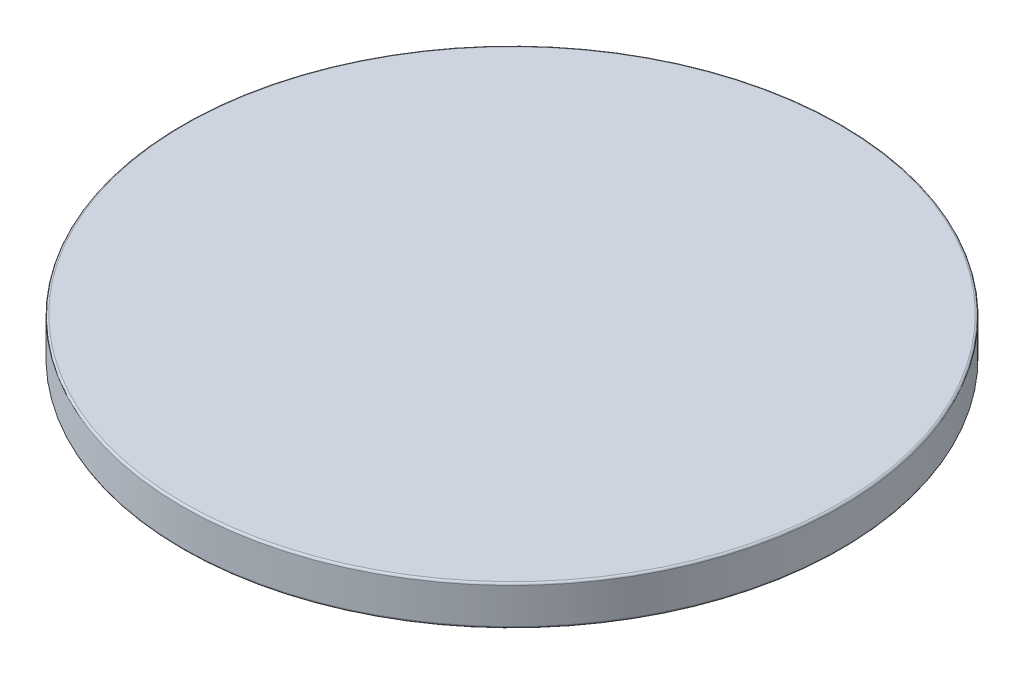
ISO-10303-21;
HEADER;
FILE_DESCRIPTION(('STEP AP214'),'2;1');
FILE_NAME('part.step','',(''),(''),'','','');
FILE_SCHEMA(('AUTOMOTIVE_DESIGN { 1 0 10303 214 1 1 1 1 }'));
ENDSEC;
DATA;
#1=APPLICATION_CONTEXT('core data for automotive mechanical design processes');
#2=APPLICATION_PROTOCOL_DEFINITION('international standard','automotive_design',2000,#1);
#3=PRODUCT_CONTEXT('',#1,'mechanical');
#4=PRODUCT('Part','Part','',(#3));
#5=PRODUCT_RELATED_PRODUCT_CATEGORY('part','',(#4));
#6=PRODUCT_DEFINITION_FORMATION('','',#4);
#7=PRODUCT_DEFINITION_CONTEXT('part definition',#1,'design');
#8=PRODUCT_DEFINITION('design','',#6,#7);
#9=PRODUCT_DEFINITION_SHAPE('','',#8);
#10=(LENGTH_UNIT() NAMED_UNIT(*) SI_UNIT(.MILLI.,.METRE.));
#11=(NAMED_UNIT(*) PLANE_ANGLE_UNIT() SI_UNIT($,.RADIAN.));
#12=(NAMED_UNIT(*) SI_UNIT($,.STERADIAN.) SOLID_ANGLE_UNIT());
#13=UNCERTAINTY_MEASURE_WITH_UNIT(LENGTH_MEASURE(1.E-05),#10,'distance_accuracy_value','');
#14=(GEOMETRIC_REPRESENTATION_CONTEXT(3) GLOBAL_UNCERTAINTY_ASSIGNED_CONTEXT((#13)) GLOBAL_UNIT_ASSIGNED_CONTEXT((#10,
#11,#12)) REPRESENTATION_CONTEXT('',''));
#15=CARTESIAN_POINT('',(0.,0.,0.));
#16=DIRECTION('',(0.,0.,1.));
#17=DIRECTION('',(1.,0.,0.));
#18=AXIS2_PLACEMENT_3D('',#15,#16,#17);
#19=CARTESIAN_POINT('',(0.,-0.749999999999999,0.));
#20=DIRECTION('',(0.,-1.,0.));
#21=DIRECTION('',(0.,0.,-1.));
#22=AXIS2_PLACEMENT_3D('',#19,#20,#21);
#23=PLANE('',#22);
#24=CARTESIAN_POINT('',(0.,-0.749999999999999,0.));
#25=DIRECTION('',(0.,1.,0.));
#26=DIRECTION('',(0.,0.,1.));
#27=AXIS2_PLACEMENT_3D('',#24,#25,#26);
#28=CIRCLE('',#27,12.4250000115459);
#29=CARTESIAN_POINT('',(0.,-0.749999999999999,12.4250000115459));
#30=VERTEX_POINT('',#29);
#31=EDGE_CURVE('E10',#30,#30,#28,.T.);
#32=ORIENTED_EDGE('',*,*,#31,.F.);
#33=EDGE_LOOP('',(#32));
#34=FACE_BOUND('',#33,.T.);
#35=ADVANCED_FACE('F31',(#34),#23,.T.);
#36=CARTESIAN_POINT('',(0.,-0.674999999999998,0.));
#37=DIRECTION('',(0.,1.,0.));
#38=DIRECTION('',(0.,0.,1.));
#39=AXIS2_PLACEMENT_3D('',#36,#37,#38);
#40=TOROIDAL_SURFACE('',#39,12.4250000115459,0.0750000000000006);
#41=ORIENTED_EDGE('',*,*,#31,.T.);
#42=EDGE_LOOP('',(#41));
#43=FACE_BOUND('',#42,.T.);
#44=CARTESIAN_POINT('',(0.,-0.674958384143944,0.));
#45=DIRECTION('',(0.,1.,0.));
#46=DIRECTION('',(0.,0.,1.));
#47=AXIS2_PLACEMENT_3D('',#44,#45,#46);
#48=CIRCLE('',#47,12.5);
#49=CARTESIAN_POINT('',(0.,-0.674958384143944,12.5));
#50=VERTEX_POINT('',#49);
#51=EDGE_CURVE('E37',#50,#50,#48,.T.);
#52=ORIENTED_EDGE('',*,*,#51,.F.);
#53=EDGE_LOOP('',(#52));
#54=FACE_BOUND('',#53,.T.);
#55=ADVANCED_FACE('F63',(#43,#54),#40,.T.);
#56=CARTESIAN_POINT('',(0.,14.4131345715046,0.));
#57=DIRECTION('',(0.,1.,0.));
#58=DIRECTION('',(0.,0.,1.));
#59=AXIS2_PLACEMENT_3D('',#56,#57,#58);
#60=CYLINDRICAL_SURFACE('',#59,12.5);
#61=ORIENTED_EDGE('',*,*,#51,.T.);
#62=EDGE_LOOP('',(#61));
#63=FACE_BOUND('',#62,.T.);
#64=CARTESIAN_POINT('',(0.,0.674958384143944,0.));
#65=DIRECTION('',(0.,1.,0.));
#66=DIRECTION('',(0.,0.,1.));
#67=AXIS2_PLACEMENT_3D('',#64,#65,#66);
#68=CIRCLE('',#67,12.5);
#69=CARTESIAN_POINT('',(0.,0.674958384143944,12.5));
#70=VERTEX_POINT('',#69);
#71=EDGE_CURVE('E41',#70,#70,#68,.T.);
#72=ORIENTED_EDGE('',*,*,#71,.F.);
#73=EDGE_LOOP('',(#72));
#74=FACE_BOUND('',#73,.T.);
#75=ADVANCED_FACE('F55',(#63,#74),#60,.T.);
#76=CARTESIAN_POINT('',(0.,0.674999999999998,0.));
#77=DIRECTION('',(0.,1.,0.));
#78=DIRECTION('',(0.,0.,1.));
#79=AXIS2_PLACEMENT_3D('',#76,#77,#78);
#80=TOROIDAL_SURFACE('',#79,12.4250000115459,0.0750000000000006);
#81=ORIENTED_EDGE('',*,*,#71,.T.);
#82=EDGE_LOOP('',(#81));
#83=FACE_BOUND('',#82,.T.);
#84=CARTESIAN_POINT('',(0.,0.749999999999999,0.));
#85=DIRECTION('',(0.,1.,0.));
#86=DIRECTION('',(0.,0.,1.));
#87=AXIS2_PLACEMENT_3D('',#84,#85,#86);
#88=CIRCLE('',#87,12.4250000115459);
#89=CARTESIAN_POINT('',(0.,0.749999999999999,12.4250000115459));
#90=VERTEX_POINT('',#89);
#91=EDGE_CURVE('E45',#90,#90,#88,.T.);
#92=ORIENTED_EDGE('',*,*,#91,.F.);
#93=EDGE_LOOP('',(#92));
#94=FACE_BOUND('',#93,.T.);
#95=ADVANCED_FACE('F53',(#83,#94),#80,.T.);
#96=CARTESIAN_POINT('',(0.,0.749999999999999,0.));
#97=DIRECTION('',(0.,1.,0.));
#98=DIRECTION('',(0.,0.,1.));
#99=AXIS2_PLACEMENT_3D('',#96,#97,#98);
#100=PLANE('',#99);
#101=ORIENTED_EDGE('',*,*,#91,.T.);
#102=EDGE_LOOP('',(#101));
#103=FACE_BOUND('',#102,.T.);
#104=ADVANCED_FACE('F51',(#103),#100,.T.);
#105=CLOSED_SHELL('',(#35,#55,#75,#95,#104));
#106=MANIFOLD_SOLID_BREP('B2',#105);
#107=ADVANCED_BREP_SHAPE_REPRESENTATION('',(#18,#106),#14);
#108=SHAPE_DEFINITION_REPRESENTATION(#9,#107);
ENDSEC;
END-ISO-10303-21;
